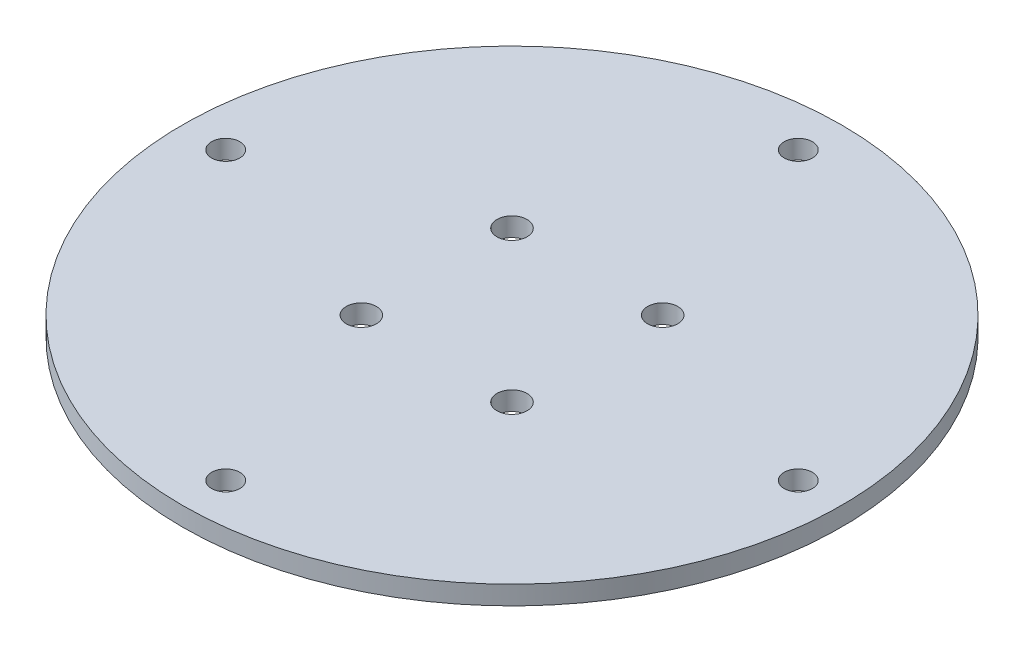
ISO-10303-21;
HEADER;
FILE_DESCRIPTION(('STEP AP214'),'2;1');
FILE_NAME('part.step','',(''),(''),'','','');
FILE_SCHEMA(('AUTOMOTIVE_DESIGN { 1 0 10303 214 1 1 1 1 }'));
ENDSEC;
DATA;
#1=APPLICATION_CONTEXT('core data for automotive mechanical design processes');
#2=APPLICATION_PROTOCOL_DEFINITION('international standard','automotive_design',2000,#1);
#3=PRODUCT_CONTEXT('',#1,'mechanical');
#4=PRODUCT('Part','Part','',(#3));
#5=PRODUCT_RELATED_PRODUCT_CATEGORY('part','',(#4));
#6=PRODUCT_DEFINITION_FORMATION('','',#4);
#7=PRODUCT_DEFINITION_CONTEXT('part definition',#1,'design');
#8=PRODUCT_DEFINITION('design','',#6,#7);
#9=PRODUCT_DEFINITION_SHAPE('','',#8);
#10=(LENGTH_UNIT() NAMED_UNIT(*) SI_UNIT(.MILLI.,.METRE.));
#11=(NAMED_UNIT(*) PLANE_ANGLE_UNIT() SI_UNIT($,.RADIAN.));
#12=(NAMED_UNIT(*) SI_UNIT($,.STERADIAN.) SOLID_ANGLE_UNIT());
#13=UNCERTAINTY_MEASURE_WITH_UNIT(LENGTH_MEASURE(1.E-05),#10,'distance_accuracy_value','');
#14=(GEOMETRIC_REPRESENTATION_CONTEXT(3) GLOBAL_UNCERTAINTY_ASSIGNED_CONTEXT((#13)) GLOBAL_UNIT_ASSIGNED_CONTEXT((#10,
#11,#12)) REPRESENTATION_CONTEXT('',''));
#15=CARTESIAN_POINT('',(0.,0.,0.));
#16=DIRECTION('',(0.,0.,1.));
#17=DIRECTION('',(1.,0.,0.));
#18=AXIS2_PLACEMENT_3D('',#15,#16,#17);
#19=CARTESIAN_POINT('',(0.,2.,0.));
#20=DIRECTION('',(0.,1.,0.));
#21=DIRECTION('',(0.,0.,1.));
#22=AXIS2_PLACEMENT_3D('',#19,#20,#21);
#23=PLANE('',#22);
#24=CARTESIAN_POINT('',(7.99999999999994,2.,8.00000000000006));
#25=DIRECTION('',(0.,1.,0.));
#26=DIRECTION('',(0.,0.,1.));
#27=AXIS2_PLACEMENT_3D('',#24,#25,#26);
#28=CIRCLE('',#27,1.6);
#29=CARTESIAN_POINT('',(7.99999999999994,2.,9.60000000000006));
#30=VERTEX_POINT('',#29);
#31=EDGE_CURVE('E77',#30,#30,#28,.T.);
#32=ORIENTED_EDGE('',*,*,#31,.F.);
#33=EDGE_LOOP('',(#32));
#34=FACE_BOUND('',#33,.T.);
#35=CARTESIAN_POINT('',(-8.,2.,-8.));
#36=DIRECTION('',(0.,1.,0.));
#37=DIRECTION('',(0.,0.,1.));
#38=AXIS2_PLACEMENT_3D('',#35,#36,#37);
#39=CIRCLE('',#38,1.6);
#40=CARTESIAN_POINT('',(-8.,2.,-6.4));
#41=VERTEX_POINT('',#40);
#42=EDGE_CURVE('E65',#41,#41,#39,.T.);
#43=ORIENTED_EDGE('',*,*,#42,.F.);
#44=EDGE_LOOP('',(#43));
#45=FACE_BOUND('',#44,.T.);
#46=CARTESIAN_POINT('',(1.8262643065692E-12,2.,30.4055915910215));
#47=DIRECTION('',(0.,1.,0.));
#48=DIRECTION('',(0.,0.,1.));
#49=AXIS2_PLACEMENT_3D('',#46,#47,#48);
#50=CIRCLE('',#49,1.50000000000185);
#51=CARTESIAN_POINT('',(1.8262643065692E-12,2.,31.9055915910233));
#52=VERTEX_POINT('',#51);
#53=EDGE_CURVE('E53',#52,#52,#50,.T.);
#54=ORIENTED_EDGE('',*,*,#53,.F.);
#55=EDGE_LOOP('',(#54));
#56=FACE_BOUND('',#55,.T.);
#57=CARTESIAN_POINT('',(-1.04298750115631E-13,2.,-30.4055915910215));
#58=DIRECTION('',(0.,1.,0.));
#59=DIRECTION('',(0.,0.,1.));
#60=AXIS2_PLACEMENT_3D('',#57,#58,#59);
#61=CIRCLE('',#60,1.5);
#62=CARTESIAN_POINT('',(-1.04298750115631E-13,2.,-28.9055915910215));
#63=VERTEX_POINT('',#62);
#64=EDGE_CURVE('E42',#63,#63,#61,.T.);
#65=ORIENTED_EDGE('',*,*,#64,.F.);
#66=EDGE_LOOP('',(#65));
#67=FACE_BOUND('',#66,.T.);
#68=CARTESIAN_POINT('',(0.,2.,0.));
#69=DIRECTION('',(0.,1.,0.));
#70=DIRECTION('',(0.,0.,1.));
#71=AXIS2_PLACEMENT_3D('',#68,#69,#70);
#72=CIRCLE('',#71,35.);
#73=CARTESIAN_POINT('',(0.,2.,35.));
#74=VERTEX_POINT('',#73);
#75=EDGE_CURVE('E10',#74,#74,#72,.T.);
#76=ORIENTED_EDGE('',*,*,#75,.T.);
#77=EDGE_LOOP('',(#76));
#78=FACE_BOUND('',#77,.T.);
#79=CARTESIAN_POINT('',(30.4055915910223,2.,-9.63947222830557E-13));
#80=DIRECTION('',(0.,1.,0.));
#81=DIRECTION('',(0.,0.,1.));
#82=AXIS2_PLACEMENT_3D('',#79,#80,#81);
#83=CIRCLE('',#82,1.50000000000067);
#84=CARTESIAN_POINT('',(30.4055915910223,2.,1.49999999999971));
#85=VERTEX_POINT('',#84);
#86=EDGE_CURVE('E47',#85,#85,#83,.T.);
#87=ORIENTED_EDGE('',*,*,#86,.F.);
#88=EDGE_LOOP('',(#87));
#89=FACE_BOUND('',#88,.T.);
#90=CARTESIAN_POINT('',(-30.4055915910206,2.,9.67670833872369E-13));
#91=DIRECTION('',(0.,1.,0.));
#92=DIRECTION('',(0.,0.,1.));
#93=AXIS2_PLACEMENT_3D('',#90,#91,#92);
#94=CIRCLE('',#93,1.50000000000138);
#95=CARTESIAN_POINT('',(-30.4055915910206,2.,1.50000000000235));
#96=VERTEX_POINT('',#95);
#97=EDGE_CURVE('E59',#96,#96,#94,.T.);
#98=ORIENTED_EDGE('',*,*,#97,.F.);
#99=EDGE_LOOP('',(#98));
#100=FACE_BOUND('',#99,.T.);
#101=CARTESIAN_POINT('',(8.00000000000003,2.,-7.99999999999997));
#102=DIRECTION('',(0.,1.,0.));
#103=DIRECTION('',(0.,0.,1.));
#104=AXIS2_PLACEMENT_3D('',#101,#102,#103);
#105=CIRCLE('',#104,1.6);
#106=CARTESIAN_POINT('',(8.00000000000003,2.,-6.39999999999997));
#107=VERTEX_POINT('',#106);
#108=EDGE_CURVE('E71',#107,#107,#105,.T.);
#109=ORIENTED_EDGE('',*,*,#108,.F.);
#110=EDGE_LOOP('',(#109));
#111=FACE_BOUND('',#110,.T.);
#112=CARTESIAN_POINT('',(-8.00000000000009,2.,7.99999999999992));
#113=DIRECTION('',(0.,1.,0.));
#114=DIRECTION('',(0.,0.,1.));
#115=AXIS2_PLACEMENT_3D('',#112,#113,#114);
#116=CIRCLE('',#115,1.6);
#117=CARTESIAN_POINT('',(-8.00000000000009,2.,9.59999999999992));
#118=VERTEX_POINT('',#117);
#119=EDGE_CURVE('E83',#118,#118,#116,.T.);
#120=ORIENTED_EDGE('',*,*,#119,.F.);
#121=EDGE_LOOP('',(#120));
#122=FACE_BOUND('',#121,.T.);
#123=ADVANCED_FACE('F31',(#34,#45,#56,#67,#78,#89,#100,#111,#122),#23,.T.);
#124=CARTESIAN_POINT('',(0.,0.,0.));
#125=DIRECTION('',(0.,1.,0.));
#126=DIRECTION('',(0.,0.,1.));
#127=AXIS2_PLACEMENT_3D('',#124,#125,#126);
#128=PLANE('',#127);
#129=CARTESIAN_POINT('',(0.,0.,0.));
#130=DIRECTION('',(0.,1.,0.));
#131=DIRECTION('',(0.,0.,1.));
#132=AXIS2_PLACEMENT_3D('',#129,#130,#131);
#133=CIRCLE('',#132,35.);
#134=CARTESIAN_POINT('',(0.,0.,35.));
#135=VERTEX_POINT('',#134);
#136=EDGE_CURVE('E35',#135,#135,#133,.T.);
#137=ORIENTED_EDGE('',*,*,#136,.F.);
#138=EDGE_LOOP('',(#137));
#139=FACE_BOUND('',#138,.T.);
#140=CARTESIAN_POINT('',(-1.04298750115631E-13,0.,-30.4055915910215));
#141=DIRECTION('',(0.,1.,0.));
#142=DIRECTION('',(0.,0.,1.));
#143=AXIS2_PLACEMENT_3D('',#140,#141,#142);
#144=CIRCLE('',#143,1.5);
#145=CARTESIAN_POINT('',(-1.04298750115631E-13,0.,-28.9055915910215));
#146=VERTEX_POINT('',#145);
#147=EDGE_CURVE('E44',#146,#146,#144,.T.);
#148=ORIENTED_EDGE('',*,*,#147,.T.);
#149=EDGE_LOOP('',(#148));
#150=FACE_BOUND('',#149,.T.);
#151=CARTESIAN_POINT('',(30.4055915910223,0.,-9.63947222830557E-13));
#152=DIRECTION('',(0.,1.,0.));
#153=DIRECTION('',(0.,0.,1.));
#154=AXIS2_PLACEMENT_3D('',#151,#152,#153);
#155=CIRCLE('',#154,1.50000000000067);
#156=CARTESIAN_POINT('',(30.4055915910223,0.,1.49999999999971));
#157=VERTEX_POINT('',#156);
#158=EDGE_CURVE('E50',#157,#157,#155,.T.);
#159=ORIENTED_EDGE('',*,*,#158,.T.);
#160=EDGE_LOOP('',(#159));
#161=FACE_BOUND('',#160,.T.);
#162=CARTESIAN_POINT('',(1.8262643065692E-12,0.,30.4055915910215));
#163=DIRECTION('',(0.,1.,0.));
#164=DIRECTION('',(0.,0.,1.));
#165=AXIS2_PLACEMENT_3D('',#162,#163,#164);
#166=CIRCLE('',#165,1.50000000000185);
#167=CARTESIAN_POINT('',(1.8262643065692E-12,0.,31.9055915910233));
#168=VERTEX_POINT('',#167);
#169=EDGE_CURVE('E56',#168,#168,#166,.T.);
#170=ORIENTED_EDGE('',*,*,#169,.T.);
#171=EDGE_LOOP('',(#170));
#172=FACE_BOUND('',#171,.T.);
#173=CARTESIAN_POINT('',(-30.4055915910206,0.,9.67670833872369E-13));
#174=DIRECTION('',(0.,1.,0.));
#175=DIRECTION('',(0.,0.,1.));
#176=AXIS2_PLACEMENT_3D('',#173,#174,#175);
#177=CIRCLE('',#176,1.50000000000138);
#178=CARTESIAN_POINT('',(-30.4055915910206,0.,1.50000000000235));
#179=VERTEX_POINT('',#178);
#180=EDGE_CURVE('E62',#179,#179,#177,.T.);
#181=ORIENTED_EDGE('',*,*,#180,.T.);
#182=EDGE_LOOP('',(#181));
#183=FACE_BOUND('',#182,.T.);
#184=CARTESIAN_POINT('',(-8.,0.,-8.));
#185=DIRECTION('',(0.,1.,0.));
#186=DIRECTION('',(0.,0.,1.));
#187=AXIS2_PLACEMENT_3D('',#184,#185,#186);
#188=CIRCLE('',#187,1.6);
#189=CARTESIAN_POINT('',(-8.,0.,-6.4));
#190=VERTEX_POINT('',#189);
#191=EDGE_CURVE('E68',#190,#190,#188,.T.);
#192=ORIENTED_EDGE('',*,*,#191,.T.);
#193=EDGE_LOOP('',(#192));
#194=FACE_BOUND('',#193,.T.);
#195=CARTESIAN_POINT('',(8.00000000000003,0.,-7.99999999999997));
#196=DIRECTION('',(0.,1.,0.));
#197=DIRECTION('',(0.,0.,1.));
#198=AXIS2_PLACEMENT_3D('',#195,#196,#197);
#199=CIRCLE('',#198,1.6);
#200=CARTESIAN_POINT('',(8.00000000000003,0.,-6.39999999999997));
#201=VERTEX_POINT('',#200);
#202=EDGE_CURVE('E74',#201,#201,#199,.T.);
#203=ORIENTED_EDGE('',*,*,#202,.T.);
#204=EDGE_LOOP('',(#203));
#205=FACE_BOUND('',#204,.T.);
#206=CARTESIAN_POINT('',(7.99999999999994,0.,8.00000000000006));
#207=DIRECTION('',(0.,1.,0.));
#208=DIRECTION('',(0.,0.,1.));
#209=AXIS2_PLACEMENT_3D('',#206,#207,#208);
#210=CIRCLE('',#209,1.6);
#211=CARTESIAN_POINT('',(7.99999999999994,0.,9.60000000000006));
#212=VERTEX_POINT('',#211);
#213=EDGE_CURVE('E80',#212,#212,#210,.T.);
#214=ORIENTED_EDGE('',*,*,#213,.T.);
#215=EDGE_LOOP('',(#214));
#216=FACE_BOUND('',#215,.T.);
#217=CARTESIAN_POINT('',(-8.00000000000009,0.,7.99999999999992));
#218=DIRECTION('',(0.,1.,0.));
#219=DIRECTION('',(0.,0.,1.));
#220=AXIS2_PLACEMENT_3D('',#217,#218,#219);
#221=CIRCLE('',#220,1.6);
#222=CARTESIAN_POINT('',(-8.00000000000009,0.,9.59999999999992));
#223=VERTEX_POINT('',#222);
#224=EDGE_CURVE('E86',#223,#223,#221,.T.);
#225=ORIENTED_EDGE('',*,*,#224,.T.);
#226=EDGE_LOOP('',(#225));
#227=FACE_BOUND('',#226,.T.);
#228=ADVANCED_FACE('F96',(#139,#150,#161,#172,#183,#194,#205,#216,#227),#128,.F.);
#229=CARTESIAN_POINT('',(0.,2.,0.));
#230=DIRECTION('',(0.,-1.,0.));
#231=DIRECTION('',(0.,0.,-1.));
#232=AXIS2_PLACEMENT_3D('',#229,#230,#231);
#233=CYLINDRICAL_SURFACE('',#232,35.);
#234=ORIENTED_EDGE('',*,*,#75,.F.);
#235=EDGE_LOOP('',(#234));
#236=FACE_BOUND('',#235,.T.);
#237=ORIENTED_EDGE('',*,*,#136,.T.);
#238=EDGE_LOOP('',(#237));
#239=FACE_BOUND('',#238,.T.);
#240=ADVANCED_FACE('F33',(#236,#239),#233,.T.);
#241=CARTESIAN_POINT('',(-1.04298750115631E-13,2.,-30.4055915910215));
#242=DIRECTION('',(0.,-1.,0.));
#243=DIRECTION('',(0.,0.,-1.));
#244=AXIS2_PLACEMENT_3D('',#241,#242,#243);
#245=CYLINDRICAL_SURFACE('',#244,1.5);
#246=ORIENTED_EDGE('',*,*,#64,.T.);
#247=EDGE_LOOP('',(#246));
#248=FACE_BOUND('',#247,.T.);
#249=ORIENTED_EDGE('',*,*,#147,.F.);
#250=EDGE_LOOP('',(#249));
#251=FACE_BOUND('',#250,.T.);
#252=ADVANCED_FACE('F106',(#248,#251),#245,.F.);
#253=CARTESIAN_POINT('',(30.4055915910223,2.,-9.63947222830557E-13));
#254=DIRECTION('',(0.,-1.,0.));
#255=DIRECTION('',(0.,0.,-1.));
#256=AXIS2_PLACEMENT_3D('',#253,#254,#255);
#257=CYLINDRICAL_SURFACE('',#256,1.50000000000067);
#258=ORIENTED_EDGE('',*,*,#86,.T.);
#259=EDGE_LOOP('',(#258));
#260=FACE_BOUND('',#259,.T.);
#261=ORIENTED_EDGE('',*,*,#158,.F.);
#262=EDGE_LOOP('',(#261));
#263=FACE_BOUND('',#262,.T.);
#264=ADVANCED_FACE('F109',(#260,#263),#257,.F.);
#265=CARTESIAN_POINT('',(1.8262643065692E-12,2.,30.4055915910215));
#266=DIRECTION('',(0.,-1.,0.));
#267=DIRECTION('',(0.,0.,-1.));
#268=AXIS2_PLACEMENT_3D('',#265,#266,#267);
#269=CYLINDRICAL_SURFACE('',#268,1.50000000000185);
#270=ORIENTED_EDGE('',*,*,#53,.T.);
#271=EDGE_LOOP('',(#270));
#272=FACE_BOUND('',#271,.T.);
#273=ORIENTED_EDGE('',*,*,#169,.F.);
#274=EDGE_LOOP('',(#273));
#275=FACE_BOUND('',#274,.T.);
#276=ADVANCED_FACE('F113',(#272,#275),#269,.F.);
#277=CARTESIAN_POINT('',(-30.4055915910206,2.,9.67670833872369E-13));
#278=DIRECTION('',(0.,-1.,0.));
#279=DIRECTION('',(0.,0.,-1.));
#280=AXIS2_PLACEMENT_3D('',#277,#278,#279);
#281=CYLINDRICAL_SURFACE('',#280,1.50000000000138);
#282=ORIENTED_EDGE('',*,*,#97,.T.);
#283=EDGE_LOOP('',(#282));
#284=FACE_BOUND('',#283,.T.);
#285=ORIENTED_EDGE('',*,*,#180,.F.);
#286=EDGE_LOOP('',(#285));
#287=FACE_BOUND('',#286,.T.);
#288=ADVANCED_FACE('F117',(#284,#287),#281,.F.);
#289=CARTESIAN_POINT('',(-8.,2.,-8.));
#290=DIRECTION('',(0.,-1.,0.));
#291=DIRECTION('',(0.,0.,-1.));
#292=AXIS2_PLACEMENT_3D('',#289,#290,#291);
#293=CYLINDRICAL_SURFACE('',#292,1.6);
#294=ORIENTED_EDGE('',*,*,#42,.T.);
#295=EDGE_LOOP('',(#294));
#296=FACE_BOUND('',#295,.T.);
#297=ORIENTED_EDGE('',*,*,#191,.F.);
#298=EDGE_LOOP('',(#297));
#299=FACE_BOUND('',#298,.T.);
#300=ADVANCED_FACE('F121',(#296,#299),#293,.F.);
#301=CARTESIAN_POINT('',(8.00000000000003,2.,-7.99999999999997));
#302=DIRECTION('',(0.,-1.,0.));
#303=DIRECTION('',(0.,0.,-1.));
#304=AXIS2_PLACEMENT_3D('',#301,#302,#303);
#305=CYLINDRICAL_SURFACE('',#304,1.6);
#306=ORIENTED_EDGE('',*,*,#108,.T.);
#307=EDGE_LOOP('',(#306));
#308=FACE_BOUND('',#307,.T.);
#309=ORIENTED_EDGE('',*,*,#202,.F.);
#310=EDGE_LOOP('',(#309));
#311=FACE_BOUND('',#310,.T.);
#312=ADVANCED_FACE('F125',(#308,#311),#305,.F.);
#313=CARTESIAN_POINT('',(7.99999999999994,2.,8.00000000000006));
#314=DIRECTION('',(0.,-1.,0.));
#315=DIRECTION('',(0.,0.,-1.));
#316=AXIS2_PLACEMENT_3D('',#313,#314,#315);
#317=CYLINDRICAL_SURFACE('',#316,1.6);
#318=ORIENTED_EDGE('',*,*,#31,.T.);
#319=EDGE_LOOP('',(#318));
#320=FACE_BOUND('',#319,.T.);
#321=ORIENTED_EDGE('',*,*,#213,.F.);
#322=EDGE_LOOP('',(#321));
#323=FACE_BOUND('',#322,.T.);
#324=ADVANCED_FACE('F129',(#320,#323),#317,.F.);
#325=CARTESIAN_POINT('',(-8.00000000000009,2.,7.99999999999992));
#326=DIRECTION('',(0.,-1.,0.));
#327=DIRECTION('',(0.,0.,-1.));
#328=AXIS2_PLACEMENT_3D('',#325,#326,#327);
#329=CYLINDRICAL_SURFACE('',#328,1.6);
#330=ORIENTED_EDGE('',*,*,#119,.T.);
#331=EDGE_LOOP('',(#330));
#332=FACE_BOUND('',#331,.T.);
#333=ORIENTED_EDGE('',*,*,#224,.F.);
#334=EDGE_LOOP('',(#333));
#335=FACE_BOUND('',#334,.T.);
#336=ADVANCED_FACE('F92',(#332,#335),#329,.F.);
#337=CLOSED_SHELL('',(#123,#228,#240,#252,#264,#276,#288,#300,#312,#324,#336));
#338=MANIFOLD_SOLID_BREP('B2',#337);
#339=ADVANCED_BREP_SHAPE_REPRESENTATION('',(#18,#338),#14);
#340=SHAPE_DEFINITION_REPRESENTATION(#9,#339);
ENDSEC;
END-ISO-10303-21;
